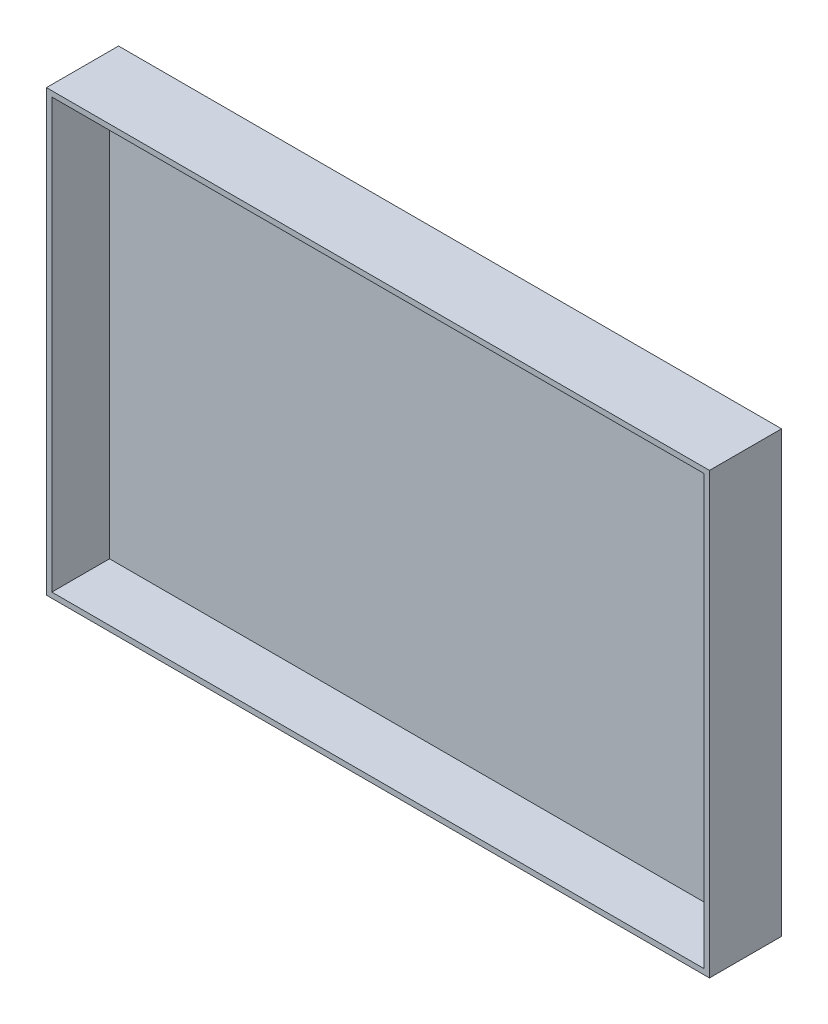
ISO-10303-21;
HEADER;
FILE_DESCRIPTION(('STEP AP214'),'2;1');
FILE_NAME('part.step','',(''),(''),'','','');
FILE_SCHEMA(('AUTOMOTIVE_DESIGN { 1 0 10303 214 1 1 1 1 }'));
ENDSEC;
DATA;
#1=APPLICATION_CONTEXT('core data for automotive mechanical design processes');
#2=APPLICATION_PROTOCOL_DEFINITION('international standard','automotive_design',2000,#1);
#3=PRODUCT_CONTEXT('',#1,'mechanical');
#4=PRODUCT('Part','Part','',(#3));
#5=PRODUCT_RELATED_PRODUCT_CATEGORY('part','',(#4));
#6=PRODUCT_DEFINITION_FORMATION('','',#4);
#7=PRODUCT_DEFINITION_CONTEXT('part definition',#1,'design');
#8=PRODUCT_DEFINITION('design','',#6,#7);
#9=PRODUCT_DEFINITION_SHAPE('','',#8);
#10=(LENGTH_UNIT() NAMED_UNIT(*) SI_UNIT(.MILLI.,.METRE.));
#11=(NAMED_UNIT(*) PLANE_ANGLE_UNIT() SI_UNIT($,.RADIAN.));
#12=(NAMED_UNIT(*) SI_UNIT($,.STERADIAN.) SOLID_ANGLE_UNIT());
#13=UNCERTAINTY_MEASURE_WITH_UNIT(LENGTH_MEASURE(1.E-05),#10,'distance_accuracy_value','');
#14=(GEOMETRIC_REPRESENTATION_CONTEXT(3) GLOBAL_UNCERTAINTY_ASSIGNED_CONTEXT((#13)) GLOBAL_UNIT_ASSIGNED_CONTEXT((#10,
#11,#12)) REPRESENTATION_CONTEXT('',''));
#15=CARTESIAN_POINT('',(0.,0.,0.));
#16=DIRECTION('',(0.,0.,1.));
#17=DIRECTION('',(1.,0.,0.));
#18=AXIS2_PLACEMENT_3D('',#15,#16,#17);
#19=CARTESIAN_POINT('',(45.25,-29.75,10.));
#20=DIRECTION('',(-1.,0.,0.));
#21=DIRECTION('',(0.,0.,1.));
#22=AXIS2_PLACEMENT_3D('',#19,#20,#21);
#23=PLANE('',#22);
#24=DIRECTION('',(0.,0.,-1.));
#25=VECTOR('',#24,1.);
#26=CARTESIAN_POINT('',(45.25,29.75,10.));
#27=LINE('',#26,#25);
#28=CARTESIAN_POINT('',(45.25,29.75,10.));
#29=VERTEX_POINT('',#28);
#30=CARTESIAN_POINT('',(45.25,29.75,2.));
#31=VERTEX_POINT('',#30);
#32=EDGE_CURVE('E112',#29,#31,#27,.T.);
#33=ORIENTED_EDGE('',*,*,#32,.T.);
#34=DIRECTION('',(0.,-1.,0.));
#35=VECTOR('',#34,1.);
#36=CARTESIAN_POINT('',(45.25,-29.75,2.));
#37=LINE('',#36,#35);
#38=CARTESIAN_POINT('',(45.25,-29.75,2.));
#39=VERTEX_POINT('',#38);
#40=EDGE_CURVE('E103',#31,#39,#37,.T.);
#41=ORIENTED_EDGE('',*,*,#40,.T.);
#42=DIRECTION('',(0.,0.,-1.));
#43=VECTOR('',#42,1.);
#44=CARTESIAN_POINT('',(45.25,-29.75,10.));
#45=LINE('',#44,#43);
#46=CARTESIAN_POINT('',(45.25,-29.75,10.));
#47=VERTEX_POINT('',#46);
#48=EDGE_CURVE('E109',#47,#39,#45,.T.);
#49=ORIENTED_EDGE('',*,*,#48,.F.);
#50=DIRECTION('',(0.,1.,0.));
#51=VECTOR('',#50,1.);
#52=CARTESIAN_POINT('',(45.25,-29.75,10.));
#53=LINE('',#52,#51);
#54=EDGE_CURVE('E114',#47,#29,#53,.T.);
#55=ORIENTED_EDGE('',*,*,#54,.T.);
#56=EDGE_LOOP('',(#33,#41,#49,#55));
#57=FACE_BOUND('',#56,.T.);
#58=ADVANCED_FACE('F39',(#57),#23,.T.);
#59=CARTESIAN_POINT('',(-45.25,29.75,10.));
#60=DIRECTION('',(0.,-1.,0.));
#61=DIRECTION('',(0.,0.,-1.));
#62=AXIS2_PLACEMENT_3D('',#59,#60,#61);
#63=PLANE('',#62);
#64=DIRECTION('',(0.,0.,-1.));
#65=VECTOR('',#64,1.);
#66=CARTESIAN_POINT('',(-45.25,29.75,10.));
#67=LINE('',#66,#65);
#68=CARTESIAN_POINT('',(-45.25,29.75,10.));
#69=VERTEX_POINT('',#68);
#70=CARTESIAN_POINT('',(-45.25,29.75,2.));
#71=VERTEX_POINT('',#70);
#72=EDGE_CURVE('E124',#69,#71,#67,.T.);
#73=ORIENTED_EDGE('',*,*,#72,.T.);
#74=DIRECTION('',(1.,0.,0.));
#75=VECTOR('',#74,1.);
#76=CARTESIAN_POINT('',(-45.25,29.75,2.));
#77=LINE('',#76,#75);
#78=EDGE_CURVE('E115',#71,#31,#77,.T.);
#79=ORIENTED_EDGE('',*,*,#78,.T.);
#80=ORIENTED_EDGE('',*,*,#32,.F.);
#81=DIRECTION('',(-1.,0.,0.));
#82=VECTOR('',#81,1.);
#83=CARTESIAN_POINT('',(-45.25,29.75,10.));
#84=LINE('',#83,#82);
#85=EDGE_CURVE('E200',#29,#69,#84,.T.);
#86=ORIENTED_EDGE('',*,*,#85,.T.);
#87=EDGE_LOOP('',(#73,#79,#80,#86));
#88=FACE_BOUND('',#87,.T.);
#89=ADVANCED_FACE('F214',(#88),#63,.T.);
#90=CARTESIAN_POINT('',(-45.25,-29.75,10.));
#91=DIRECTION('',(1.,0.,0.));
#92=DIRECTION('',(0.,0.,-1.));
#93=AXIS2_PLACEMENT_3D('',#90,#91,#92);
#94=PLANE('',#93);
#95=DIRECTION('',(0.,0.,-1.));
#96=VECTOR('',#95,1.);
#97=CARTESIAN_POINT('',(-45.25,-29.75,10.));
#98=LINE('',#97,#96);
#99=CARTESIAN_POINT('',(-45.25,-29.75,10.));
#100=VERTEX_POINT('',#99);
#101=CARTESIAN_POINT('',(-45.25,-29.75,2.));
#102=VERTEX_POINT('',#101);
#103=EDGE_CURVE('E61',#100,#102,#98,.T.);
#104=ORIENTED_EDGE('',*,*,#103,.T.);
#105=DIRECTION('',(0.,1.,0.));
#106=VECTOR('',#105,1.);
#107=CARTESIAN_POINT('',(-45.25,-29.75,2.));
#108=LINE('',#107,#106);
#109=EDGE_CURVE('E55',#102,#71,#108,.T.);
#110=ORIENTED_EDGE('',*,*,#109,.T.);
#111=ORIENTED_EDGE('',*,*,#72,.F.);
#112=DIRECTION('',(0.,-1.,0.));
#113=VECTOR('',#112,1.);
#114=CARTESIAN_POINT('',(-45.25,-29.75,10.));
#115=LINE('',#114,#113);
#116=EDGE_CURVE('E126',#69,#100,#115,.T.);
#117=ORIENTED_EDGE('',*,*,#116,.T.);
#118=EDGE_LOOP('',(#104,#110,#111,#117));
#119=FACE_BOUND('',#118,.T.);
#120=ADVANCED_FACE('F213',(#119),#94,.T.);
#121=CARTESIAN_POINT('',(-45.25,-29.75,10.));
#122=DIRECTION('',(0.,1.,0.));
#123=DIRECTION('',(0.,0.,1.));
#124=AXIS2_PLACEMENT_3D('',#121,#122,#123);
#125=PLANE('',#124);
#126=ORIENTED_EDGE('',*,*,#48,.T.);
#127=DIRECTION('',(-1.,0.,0.));
#128=VECTOR('',#127,1.);
#129=CARTESIAN_POINT('',(-45.25,-29.75,2.));
#130=LINE('',#129,#128);
#131=EDGE_CURVE('E11',#39,#102,#130,.T.);
#132=ORIENTED_EDGE('',*,*,#131,.T.);
#133=ORIENTED_EDGE('',*,*,#103,.F.);
#134=DIRECTION('',(1.,0.,0.));
#135=VECTOR('',#134,1.);
#136=CARTESIAN_POINT('',(-45.25,-29.75,10.));
#137=LINE('',#136,#135);
#138=EDGE_CURVE('E119',#100,#47,#137,.T.);
#139=ORIENTED_EDGE('',*,*,#138,.T.);
#140=EDGE_LOOP('',(#126,#132,#133,#139));
#141=FACE_BOUND('',#140,.T.);
#142=ADVANCED_FACE('F117',(#141),#125,.T.);
#143=CARTESIAN_POINT('',(0.,0.,10.));
#144=DIRECTION('',(0.,0.,1.));
#145=DIRECTION('',(1.,0.,0.));
#146=AXIS2_PLACEMENT_3D('',#143,#144,#145);
#147=PLANE('',#146);
#148=DIRECTION('',(0.,-1.,0.));
#149=VECTOR('',#148,1.);
#150=CARTESIAN_POINT('',(-46.,-30.5,10.));
#151=LINE('',#150,#149);
#152=CARTESIAN_POINT('',(-46.,30.5,10.));
#153=VERTEX_POINT('',#152);
#154=CARTESIAN_POINT('',(-46.,-30.5,10.));
#155=VERTEX_POINT('',#154);
#156=EDGE_CURVE('E136',#153,#155,#151,.T.);
#157=ORIENTED_EDGE('',*,*,#156,.T.);
#158=DIRECTION('',(1.,0.,0.));
#159=VECTOR('',#158,1.);
#160=CARTESIAN_POINT('',(46.,-30.5,10.));
#161=LINE('',#160,#159);
#162=CARTESIAN_POINT('',(46.,-30.5,10.));
#163=VERTEX_POINT('',#162);
#164=EDGE_CURVE('E140',#155,#163,#161,.T.);
#165=ORIENTED_EDGE('',*,*,#164,.T.);
#166=DIRECTION('',(0.,1.,0.));
#167=VECTOR('',#166,1.);
#168=CARTESIAN_POINT('',(46.,-30.5,10.));
#169=LINE('',#168,#167);
#170=CARTESIAN_POINT('',(46.,30.5,10.));
#171=VERTEX_POINT('',#170);
#172=EDGE_CURVE('E144',#163,#171,#169,.T.);
#173=ORIENTED_EDGE('',*,*,#172,.T.);
#174=DIRECTION('',(-1.,0.,0.));
#175=VECTOR('',#174,1.);
#176=CARTESIAN_POINT('',(46.,30.5,10.));
#177=LINE('',#176,#175);
#178=EDGE_CURVE('E147',#171,#153,#177,.T.);
#179=ORIENTED_EDGE('',*,*,#178,.T.);
#180=EDGE_LOOP('',(#157,#165,#173,#179));
#181=FACE_BOUND('',#180,.T.);
#182=ORIENTED_EDGE('',*,*,#85,.F.);
#183=ORIENTED_EDGE('',*,*,#54,.F.);
#184=ORIENTED_EDGE('',*,*,#138,.F.);
#185=ORIENTED_EDGE('',*,*,#116,.F.);
#186=EDGE_LOOP('',(#182,#183,#184,#185));
#187=FACE_BOUND('',#186,.T.);
#188=ADVANCED_FACE('F194',(#181,#187),#147,.T.);
#189=CARTESIAN_POINT('',(0.,0.,0.));
#190=DIRECTION('',(0.,0.,1.));
#191=DIRECTION('',(1.,0.,0.));
#192=AXIS2_PLACEMENT_3D('',#189,#190,#191);
#193=PLANE('',#192);
#194=DIRECTION('',(0.,-1.,0.));
#195=VECTOR('',#194,1.);
#196=CARTESIAN_POINT('',(-46.,-30.5,0.));
#197=LINE('',#196,#195);
#198=CARTESIAN_POINT('',(-46.,30.5,0.));
#199=VERTEX_POINT('',#198);
#200=CARTESIAN_POINT('',(-46.,-30.5,0.));
#201=VERTEX_POINT('',#200);
#202=EDGE_CURVE('E135',#199,#201,#197,.T.);
#203=ORIENTED_EDGE('',*,*,#202,.F.);
#204=DIRECTION('',(-1.,0.,0.));
#205=VECTOR('',#204,1.);
#206=CARTESIAN_POINT('',(46.,30.5,0.));
#207=LINE('',#206,#205);
#208=CARTESIAN_POINT('',(46.,30.5,0.));
#209=VERTEX_POINT('',#208);
#210=EDGE_CURVE('E141',#209,#199,#207,.T.);
#211=ORIENTED_EDGE('',*,*,#210,.F.);
#212=DIRECTION('',(0.,1.,0.));
#213=VECTOR('',#212,1.);
#214=CARTESIAN_POINT('',(46.,-30.5,0.));
#215=LINE('',#214,#213);
#216=CARTESIAN_POINT('',(46.,-30.5,0.));
#217=VERTEX_POINT('',#216);
#218=EDGE_CURVE('E158',#217,#209,#215,.T.);
#219=ORIENTED_EDGE('',*,*,#218,.F.);
#220=DIRECTION('',(1.,0.,0.));
#221=VECTOR('',#220,1.);
#222=CARTESIAN_POINT('',(46.,-30.5,0.));
#223=LINE('',#222,#221);
#224=EDGE_CURVE('E154',#201,#217,#223,.T.);
#225=ORIENTED_EDGE('',*,*,#224,.F.);
#226=EDGE_LOOP('',(#203,#211,#219,#225));
#227=FACE_BOUND('',#226,.T.);
#228=ADVANCED_FACE('F183',(#227),#193,.F.);
#229=CARTESIAN_POINT('',(-46.,-30.5,10.));
#230=DIRECTION('',(1.,0.,0.));
#231=DIRECTION('',(0.,0.,-1.));
#232=AXIS2_PLACEMENT_3D('',#229,#230,#231);
#233=PLANE('',#232);
#234=ORIENTED_EDGE('',*,*,#202,.T.);
#235=DIRECTION('',(0.,0.,-1.));
#236=VECTOR('',#235,1.);
#237=CARTESIAN_POINT('',(-46.,-30.5,10.));
#238=LINE('',#237,#236);
#239=EDGE_CURVE('E48',#155,#201,#238,.T.);
#240=ORIENTED_EDGE('',*,*,#239,.F.);
#241=ORIENTED_EDGE('',*,*,#156,.F.);
#242=DIRECTION('',(0.,0.,-1.));
#243=VECTOR('',#242,1.);
#244=CARTESIAN_POINT('',(-46.,30.5,10.));
#245=LINE('',#244,#243);
#246=EDGE_CURVE('E150',#153,#199,#245,.T.);
#247=ORIENTED_EDGE('',*,*,#246,.T.);
#248=EDGE_LOOP('',(#234,#240,#241,#247));
#249=FACE_BOUND('',#248,.T.);
#250=ADVANCED_FACE('F41',(#249),#233,.F.);
#251=CARTESIAN_POINT('',(46.,-30.5,10.));
#252=DIRECTION('',(0.,1.,0.));
#253=DIRECTION('',(-1.,0.,0.));
#254=AXIS2_PLACEMENT_3D('',#251,#252,#253);
#255=PLANE('',#254);
#256=ORIENTED_EDGE('',*,*,#224,.T.);
#257=DIRECTION('',(0.,0.,-1.));
#258=VECTOR('',#257,1.);
#259=CARTESIAN_POINT('',(46.,-30.5,10.));
#260=LINE('',#259,#258);
#261=EDGE_CURVE('E170',#163,#217,#260,.T.);
#262=ORIENTED_EDGE('',*,*,#261,.F.);
#263=ORIENTED_EDGE('',*,*,#164,.F.);
#264=ORIENTED_EDGE('',*,*,#239,.T.);
#265=EDGE_LOOP('',(#256,#262,#263,#264));
#266=FACE_BOUND('',#265,.T.);
#267=ADVANCED_FACE('F176',(#266),#255,.F.);
#268=CARTESIAN_POINT('',(46.,-30.5,10.));
#269=DIRECTION('',(-1.,0.,0.));
#270=DIRECTION('',(0.,0.,1.));
#271=AXIS2_PLACEMENT_3D('',#268,#269,#270);
#272=PLANE('',#271);
#273=ORIENTED_EDGE('',*,*,#218,.T.);
#274=DIRECTION('',(0.,0.,-1.));
#275=VECTOR('',#274,1.);
#276=CARTESIAN_POINT('',(46.,30.5,10.));
#277=LINE('',#276,#275);
#278=EDGE_CURVE('E167',#171,#209,#277,.T.);
#279=ORIENTED_EDGE('',*,*,#278,.F.);
#280=ORIENTED_EDGE('',*,*,#172,.F.);
#281=ORIENTED_EDGE('',*,*,#261,.T.);
#282=EDGE_LOOP('',(#273,#279,#280,#281));
#283=FACE_BOUND('',#282,.T.);
#284=ADVANCED_FACE('F192',(#283),#272,.F.);
#285=CARTESIAN_POINT('',(46.,30.5,10.));
#286=DIRECTION('',(0.,-1.,0.));
#287=DIRECTION('',(1.,0.,0.));
#288=AXIS2_PLACEMENT_3D('',#285,#286,#287);
#289=PLANE('',#288);
#290=ORIENTED_EDGE('',*,*,#210,.T.);
#291=ORIENTED_EDGE('',*,*,#246,.F.);
#292=ORIENTED_EDGE('',*,*,#178,.F.);
#293=ORIENTED_EDGE('',*,*,#278,.T.);
#294=EDGE_LOOP('',(#290,#291,#292,#293));
#295=FACE_BOUND('',#294,.T.);
#296=ADVANCED_FACE('F188',(#295),#289,.F.);
#297=CARTESIAN_POINT('',(0.,0.,2.));
#298=DIRECTION('',(0.,0.,-1.));
#299=DIRECTION('',(-1.,0.,0.));
#300=AXIS2_PLACEMENT_3D('',#297,#298,#299);
#301=PLANE('',#300);
#302=ORIENTED_EDGE('',*,*,#40,.F.);
#303=ORIENTED_EDGE('',*,*,#78,.F.);
#304=ORIENTED_EDGE('',*,*,#109,.F.);
#305=ORIENTED_EDGE('',*,*,#131,.F.);
#306=EDGE_LOOP('',(#302,#303,#304,#305));
#307=FACE_BOUND('',#306,.T.);
#308=ADVANCED_FACE('F102',(#307),#301,.F.);
#309=CLOSED_SHELL('',(#58,#89,#120,#142,#188,#228,#250,#267,#284,#296,#308));
#310=MANIFOLD_SOLID_BREP('B2',#309);
#311=ADVANCED_BREP_SHAPE_REPRESENTATION('',(#18,#310),#14);
#312=SHAPE_DEFINITION_REPRESENTATION(#9,#311);
ENDSEC;
END-ISO-10303-21;
